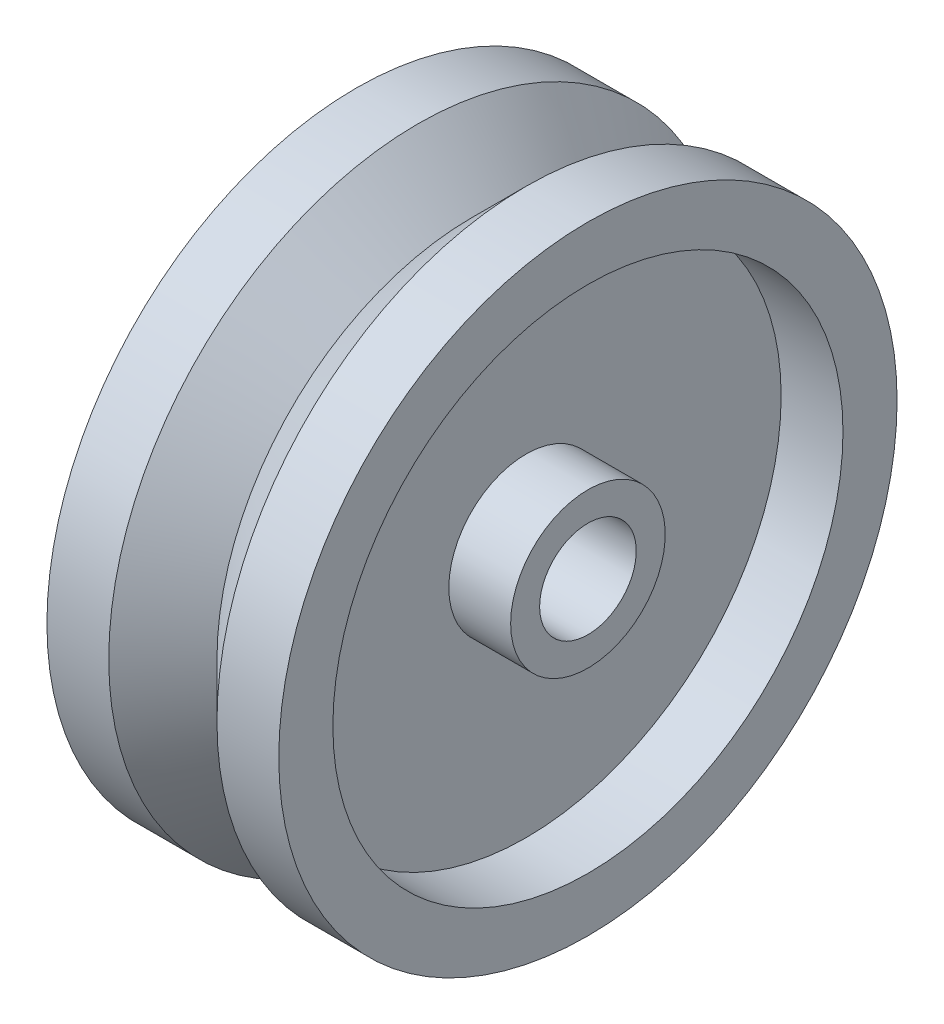
ISO-10303-21;
HEADER;
FILE_DESCRIPTION(('STEP AP214'),'2;1');
FILE_NAME('part.step','',(''),(''),'','','');
FILE_SCHEMA(('AUTOMOTIVE_DESIGN { 1 0 10303 214 1 1 1 1 }'));
ENDSEC;
DATA;
#1=APPLICATION_CONTEXT('core data for automotive mechanical design processes');
#2=APPLICATION_PROTOCOL_DEFINITION('international standard','automotive_design',2000,#1);
#3=PRODUCT_CONTEXT('',#1,'mechanical');
#4=PRODUCT('Part','Part','',(#3));
#5=PRODUCT_RELATED_PRODUCT_CATEGORY('part','',(#4));
#6=PRODUCT_DEFINITION_FORMATION('','',#4);
#7=PRODUCT_DEFINITION_CONTEXT('part definition',#1,'design');
#8=PRODUCT_DEFINITION('design','',#6,#7);
#9=PRODUCT_DEFINITION_SHAPE('','',#8);
#10=(LENGTH_UNIT() NAMED_UNIT(*) SI_UNIT(.MILLI.,.METRE.));
#11=(NAMED_UNIT(*) PLANE_ANGLE_UNIT() SI_UNIT($,.RADIAN.));
#12=(NAMED_UNIT(*) SI_UNIT($,.STERADIAN.) SOLID_ANGLE_UNIT());
#13=UNCERTAINTY_MEASURE_WITH_UNIT(LENGTH_MEASURE(1.E-05),#10,'distance_accuracy_value','');
#14=(GEOMETRIC_REPRESENTATION_CONTEXT(3) GLOBAL_UNCERTAINTY_ASSIGNED_CONTEXT((#13)) GLOBAL_UNIT_ASSIGNED_CONTEXT((#10,
#11,#12)) REPRESENTATION_CONTEXT('',''));
#15=CARTESIAN_POINT('',(0.,0.,0.));
#16=DIRECTION('',(0.,0.,1.));
#17=DIRECTION('',(1.,0.,0.));
#18=AXIS2_PLACEMENT_3D('',#15,#16,#17);
#19=CARTESIAN_POINT('',(-49.1417910447762,0.,0.));
#20=DIRECTION('',(-1.,0.,0.));
#21=DIRECTION('',(0.,0.,1.));
#22=AXIS2_PLACEMENT_3D('',#19,#20,#21);
#23=CYLINDRICAL_SURFACE('',#22,16.5);
#24=CARTESIAN_POINT('',(3.5,0.,0.));
#25=DIRECTION('',(-1.,0.,0.));
#26=DIRECTION('',(0.,0.,1.));
#27=AXIS2_PLACEMENT_3D('',#24,#25,#26);
#28=CIRCLE('',#27,16.5);
#29=CARTESIAN_POINT('',(3.5,0.,16.5));
#30=VERTEX_POINT('',#29);
#31=EDGE_CURVE('E92',#30,#30,#28,.T.);
#32=ORIENTED_EDGE('',*,*,#31,.T.);
#33=EDGE_LOOP('',(#32));
#34=FACE_BOUND('',#33,.T.);
#35=CARTESIAN_POINT('',(7.49999999999999,0.,0.));
#36=DIRECTION('',(-1.,0.,0.));
#37=DIRECTION('',(0.,0.,1.));
#38=AXIS2_PLACEMENT_3D('',#35,#36,#37);
#39=CIRCLE('',#38,16.5);
#40=CARTESIAN_POINT('',(7.49999999999999,0.,16.5));
#41=VERTEX_POINT('',#40);
#42=EDGE_CURVE('E10',#41,#41,#39,.T.);
#43=ORIENTED_EDGE('',*,*,#42,.F.);
#44=EDGE_LOOP('',(#43));
#45=FACE_BOUND('',#44,.T.);
#46=ADVANCED_FACE('F43',(#34,#45),#23,.F.);
#47=CARTESIAN_POINT('',(7.5,0.,0.));
#48=DIRECTION('',(1.,0.,0.));
#49=DIRECTION('',(0.,0.,-1.));
#50=AXIS2_PLACEMENT_3D('',#47,#48,#49);
#51=PLANE('',#50);
#52=ORIENTED_EDGE('',*,*,#42,.T.);
#53=EDGE_LOOP('',(#52));
#54=FACE_BOUND('',#53,.T.);
#55=CARTESIAN_POINT('',(7.49999999999999,0.,0.));
#56=DIRECTION('',(-1.,0.,0.));
#57=DIRECTION('',(0.,0.,1.));
#58=AXIS2_PLACEMENT_3D('',#55,#56,#57);
#59=CIRCLE('',#58,20.);
#60=CARTESIAN_POINT('',(7.49999999999999,0.,20.));
#61=VERTEX_POINT('',#60);
#62=EDGE_CURVE('E49',#61,#61,#59,.T.);
#63=ORIENTED_EDGE('',*,*,#62,.F.);
#64=EDGE_LOOP('',(#63));
#65=FACE_BOUND('',#64,.T.);
#66=ADVANCED_FACE('F110',(#54,#65),#51,.T.);
#67=CARTESIAN_POINT('',(-49.1417910447762,0.,0.));
#68=DIRECTION('',(-1.,0.,0.));
#69=DIRECTION('',(0.,0.,1.));
#70=AXIS2_PLACEMENT_3D('',#67,#68,#69);
#71=CYLINDRICAL_SURFACE('',#70,20.);
#72=ORIENTED_EDGE('',*,*,#62,.T.);
#73=EDGE_LOOP('',(#72));
#74=FACE_BOUND('',#73,.T.);
#75=CARTESIAN_POINT('',(3.49999999999982,0.,0.));
#76=DIRECTION('',(-1.,0.,0.));
#77=DIRECTION('',(0.,0.,1.));
#78=AXIS2_PLACEMENT_3D('',#75,#76,#77);
#79=CIRCLE('',#78,20.);
#80=CARTESIAN_POINT('',(3.49999999999982,0.,20.));
#81=VERTEX_POINT('',#80);
#82=EDGE_CURVE('E53',#81,#81,#79,.T.);
#83=ORIENTED_EDGE('',*,*,#82,.F.);
#84=EDGE_LOOP('',(#83));
#85=FACE_BOUND('',#84,.T.);
#86=ADVANCED_FACE('F114',(#74,#85),#71,.T.);
#87=CARTESIAN_POINT('',(0.,0.,0.));
#88=DIRECTION('',(1.,0.,0.));
#89=DIRECTION('',(0.,0.,-1.));
#90=AXIS2_PLACEMENT_3D('',#87,#88,#89);
#91=CONICAL_SURFACE('',#90,16.5,0.785398163397469);
#92=ORIENTED_EDGE('',*,*,#82,.T.);
#93=EDGE_LOOP('',(#92));
#94=FACE_BOUND('',#93,.T.);
#95=CARTESIAN_POINT('',(0.,0.,0.));
#96=DIRECTION('',(-1.,0.,0.));
#97=DIRECTION('',(0.,0.,1.));
#98=AXIS2_PLACEMENT_3D('',#95,#96,#97);
#99=CIRCLE('',#98,16.5);
#100=CARTESIAN_POINT('',(0.,0.,16.5));
#101=VERTEX_POINT('',#100);
#102=EDGE_CURVE('E57',#101,#101,#99,.T.);
#103=ORIENTED_EDGE('',*,*,#102,.F.);
#104=EDGE_LOOP('',(#103));
#105=FACE_BOUND('',#104,.T.);
#106=ADVANCED_FACE('F119',(#94,#105),#91,.T.);
#107=CARTESIAN_POINT('',(-3.5,0.,0.));
#108=DIRECTION('',(-1.,0.,0.));
#109=DIRECTION('',(0.,0.,1.));
#110=AXIS2_PLACEMENT_3D('',#107,#108,#109);
#111=CONICAL_SURFACE('',#110,20.,0.785398163397448);
#112=ORIENTED_EDGE('',*,*,#102,.T.);
#113=EDGE_LOOP('',(#112));
#114=FACE_BOUND('',#113,.T.);
#115=CARTESIAN_POINT('',(-3.5,0.,0.));
#116=DIRECTION('',(-1.,0.,0.));
#117=DIRECTION('',(0.,0.,1.));
#118=AXIS2_PLACEMENT_3D('',#115,#116,#117);
#119=CIRCLE('',#118,20.);
#120=CARTESIAN_POINT('',(-3.5,0.,20.));
#121=VERTEX_POINT('',#120);
#122=EDGE_CURVE('E62',#121,#121,#119,.T.);
#123=ORIENTED_EDGE('',*,*,#122,.F.);
#124=EDGE_LOOP('',(#123));
#125=FACE_BOUND('',#124,.T.);
#126=ADVANCED_FACE('F161',(#114,#125),#111,.T.);
#127=CARTESIAN_POINT('',(-49.1417910447762,0.,0.));
#128=DIRECTION('',(-1.,0.,0.));
#129=DIRECTION('',(0.,0.,1.));
#130=AXIS2_PLACEMENT_3D('',#127,#128,#129);
#131=CYLINDRICAL_SURFACE('',#130,20.);
#132=ORIENTED_EDGE('',*,*,#122,.T.);
#133=EDGE_LOOP('',(#132));
#134=FACE_BOUND('',#133,.T.);
#135=CARTESIAN_POINT('',(-7.50000000000001,0.,0.));
#136=DIRECTION('',(-1.,0.,0.));
#137=DIRECTION('',(0.,0.,1.));
#138=AXIS2_PLACEMENT_3D('',#135,#136,#137);
#139=CIRCLE('',#138,20.);
#140=CARTESIAN_POINT('',(-7.50000000000001,0.,20.));
#141=VERTEX_POINT('',#140);
#142=EDGE_CURVE('E65',#141,#141,#139,.T.);
#143=ORIENTED_EDGE('',*,*,#142,.F.);
#144=EDGE_LOOP('',(#143));
#145=FACE_BOUND('',#144,.T.);
#146=ADVANCED_FACE('F158',(#134,#145),#131,.T.);
#147=CARTESIAN_POINT('',(-7.5,0.,0.));
#148=DIRECTION('',(1.,0.,0.));
#149=DIRECTION('',(0.,0.,-1.));
#150=AXIS2_PLACEMENT_3D('',#147,#148,#149);
#151=PLANE('',#150);
#152=CARTESIAN_POINT('',(-7.5,0.,0.));
#153=DIRECTION('',(-1.,0.,0.));
#154=DIRECTION('',(0.,0.,1.));
#155=AXIS2_PLACEMENT_3D('',#152,#153,#154);
#156=CIRCLE('',#155,16.5);
#157=CARTESIAN_POINT('',(-7.5,0.,16.5));
#158=VERTEX_POINT('',#157);
#159=EDGE_CURVE('E68',#158,#158,#156,.T.);
#160=ORIENTED_EDGE('',*,*,#159,.F.);
#161=EDGE_LOOP('',(#160));
#162=FACE_BOUND('',#161,.T.);
#163=ORIENTED_EDGE('',*,*,#142,.T.);
#164=EDGE_LOOP('',(#163));
#165=FACE_BOUND('',#164,.T.);
#166=ADVANCED_FACE('F141',(#162,#165),#151,.F.);
#167=CARTESIAN_POINT('',(-49.1417910447762,0.,0.));
#168=DIRECTION('',(-1.,0.,0.));
#169=DIRECTION('',(0.,0.,1.));
#170=AXIS2_PLACEMENT_3D('',#167,#168,#169);
#171=CYLINDRICAL_SURFACE('',#170,16.5);
#172=CARTESIAN_POINT('',(-3.5,0.,0.));
#173=DIRECTION('',(-1.,0.,0.));
#174=DIRECTION('',(0.,0.,1.));
#175=AXIS2_PLACEMENT_3D('',#172,#173,#174);
#176=CIRCLE('',#175,16.5);
#177=CARTESIAN_POINT('',(-3.5,0.,16.5));
#178=VERTEX_POINT('',#177);
#179=EDGE_CURVE('E71',#178,#178,#176,.T.);
#180=ORIENTED_EDGE('',*,*,#179,.F.);
#181=EDGE_LOOP('',(#180));
#182=FACE_BOUND('',#181,.T.);
#183=ORIENTED_EDGE('',*,*,#159,.T.);
#184=EDGE_LOOP('',(#183));
#185=FACE_BOUND('',#184,.T.);
#186=ADVANCED_FACE('F151',(#182,#185),#171,.F.);
#187=CARTESIAN_POINT('',(-3.5,0.,0.));
#188=DIRECTION('',(1.,0.,0.));
#189=DIRECTION('',(0.,0.,-1.));
#190=AXIS2_PLACEMENT_3D('',#187,#188,#189);
#191=PLANE('',#190);
#192=CARTESIAN_POINT('',(-3.5,0.,0.));
#193=DIRECTION('',(-1.,0.,0.));
#194=DIRECTION('',(0.,0.,1.));
#195=AXIS2_PLACEMENT_3D('',#192,#193,#194);
#196=CIRCLE('',#195,5.);
#197=CARTESIAN_POINT('',(-3.5,0.,5.));
#198=VERTEX_POINT('',#197);
#199=EDGE_CURVE('E74',#198,#198,#196,.T.);
#200=ORIENTED_EDGE('',*,*,#199,.F.);
#201=EDGE_LOOP('',(#200));
#202=FACE_BOUND('',#201,.T.);
#203=ORIENTED_EDGE('',*,*,#179,.T.);
#204=EDGE_LOOP('',(#203));
#205=FACE_BOUND('',#204,.T.);
#206=ADVANCED_FACE('F145',(#202,#205),#191,.F.);
#207=CARTESIAN_POINT('',(-49.1417910447762,0.,0.));
#208=DIRECTION('',(-1.,0.,0.));
#209=DIRECTION('',(0.,0.,1.));
#210=AXIS2_PLACEMENT_3D('',#207,#208,#209);
#211=CYLINDRICAL_SURFACE('',#210,5.);
#212=ORIENTED_EDGE('',*,*,#199,.T.);
#213=EDGE_LOOP('',(#212));
#214=FACE_BOUND('',#213,.T.);
#215=CARTESIAN_POINT('',(-7.5,0.,0.));
#216=DIRECTION('',(-1.,0.,0.));
#217=DIRECTION('',(0.,0.,1.));
#218=AXIS2_PLACEMENT_3D('',#215,#216,#217);
#219=CIRCLE('',#218,5.);
#220=CARTESIAN_POINT('',(-7.5,0.,5.));
#221=VERTEX_POINT('',#220);
#222=EDGE_CURVE('E77',#221,#221,#219,.T.);
#223=ORIENTED_EDGE('',*,*,#222,.F.);
#224=EDGE_LOOP('',(#223));
#225=FACE_BOUND('',#224,.T.);
#226=ADVANCED_FACE('F139',(#214,#225),#211,.T.);
#227=CARTESIAN_POINT('',(-7.5,0.,0.));
#228=DIRECTION('',(-1.,0.,0.));
#229=DIRECTION('',(0.,0.,1.));
#230=AXIS2_PLACEMENT_3D('',#227,#228,#229);
#231=CIRCLE('',#230,3.125);
#232=CARTESIAN_POINT('',(-7.5,0.,3.125));
#233=VERTEX_POINT('',#232);
#234=EDGE_CURVE('E80',#233,#233,#231,.T.);
#235=ORIENTED_EDGE('',*,*,#234,.F.);
#236=EDGE_LOOP('',(#235));
#237=FACE_BOUND('',#236,.T.);
#238=ORIENTED_EDGE('',*,*,#222,.T.);
#239=EDGE_LOOP('',(#238));
#240=FACE_BOUND('',#239,.T.);
#241=ADVANCED_FACE('F128',(#237,#240),#151,.F.);
#242=CARTESIAN_POINT('',(-49.1417910447762,0.,0.));
#243=DIRECTION('',(-1.,0.,0.));
#244=DIRECTION('',(0.,0.,1.));
#245=AXIS2_PLACEMENT_3D('',#242,#243,#244);
#246=CYLINDRICAL_SURFACE('',#245,3.125);
#247=CARTESIAN_POINT('',(7.5,0.,0.));
#248=DIRECTION('',(-1.,0.,0.));
#249=DIRECTION('',(0.,0.,1.));
#250=AXIS2_PLACEMENT_3D('',#247,#248,#249);
#251=CIRCLE('',#250,3.125);
#252=CARTESIAN_POINT('',(7.5,0.,3.125));
#253=VERTEX_POINT('',#252);
#254=EDGE_CURVE('E83',#253,#253,#251,.T.);
#255=ORIENTED_EDGE('',*,*,#254,.F.);
#256=EDGE_LOOP('',(#255));
#257=FACE_BOUND('',#256,.T.);
#258=ORIENTED_EDGE('',*,*,#234,.T.);
#259=EDGE_LOOP('',(#258));
#260=FACE_BOUND('',#259,.T.);
#261=ADVANCED_FACE('F123',(#257,#260),#246,.F.);
#262=ORIENTED_EDGE('',*,*,#254,.T.);
#263=EDGE_LOOP('',(#262));
#264=FACE_BOUND('',#263,.T.);
#265=CARTESIAN_POINT('',(7.5,0.,0.));
#266=DIRECTION('',(-1.,0.,0.));
#267=DIRECTION('',(0.,0.,1.));
#268=AXIS2_PLACEMENT_3D('',#265,#266,#267);
#269=CIRCLE('',#268,5.);
#270=CARTESIAN_POINT('',(7.5,0.,5.));
#271=VERTEX_POINT('',#270);
#272=EDGE_CURVE('E86',#271,#271,#269,.T.);
#273=ORIENTED_EDGE('',*,*,#272,.F.);
#274=EDGE_LOOP('',(#273));
#275=FACE_BOUND('',#274,.T.);
#276=ADVANCED_FACE('F106',(#264,#275),#51,.T.);
#277=CARTESIAN_POINT('',(-49.1417910447762,0.,0.));
#278=DIRECTION('',(-1.,0.,0.));
#279=DIRECTION('',(0.,0.,1.));
#280=AXIS2_PLACEMENT_3D('',#277,#278,#279);
#281=CYLINDRICAL_SURFACE('',#280,5.00000000000003);
#282=CARTESIAN_POINT('',(3.50000000000015,0.,0.));
#283=DIRECTION('',(-1.,0.,0.));
#284=DIRECTION('',(0.,0.,1.));
#285=AXIS2_PLACEMENT_3D('',#282,#283,#284);
#286=CIRCLE('',#285,5.00000000000005);
#287=CARTESIAN_POINT('',(3.50000000000015,0.,5.00000000000005));
#288=VERTEX_POINT('',#287);
#289=EDGE_CURVE('E89',#288,#288,#286,.T.);
#290=ORIENTED_EDGE('',*,*,#289,.F.);
#291=EDGE_LOOP('',(#290));
#292=FACE_BOUND('',#291,.T.);
#293=ORIENTED_EDGE('',*,*,#272,.T.);
#294=EDGE_LOOP('',(#293));
#295=FACE_BOUND('',#294,.T.);
#296=ADVANCED_FACE('F100',(#292,#295),#281,.T.);
#297=CARTESIAN_POINT('',(3.50000000000008,0.,0.));
#298=DIRECTION('',(1.,0.,0.));
#299=DIRECTION('',(0.,0.,-1.));
#300=AXIS2_PLACEMENT_3D('',#297,#298,#299);
#301=PLANE('',#300);
#302=ORIENTED_EDGE('',*,*,#289,.T.);
#303=EDGE_LOOP('',(#302));
#304=FACE_BOUND('',#303,.T.);
#305=ORIENTED_EDGE('',*,*,#31,.F.);
#306=EDGE_LOOP('',(#305));
#307=FACE_BOUND('',#306,.T.);
#308=ADVANCED_FACE('F98',(#304,#307),#301,.T.);
#309=CLOSED_SHELL('',(#46,#66,#86,#106,#126,#146,#166,#186,#206,#226,#241,#261,#276,#296,#308));
#310=MANIFOLD_SOLID_BREP('B2',#309);
#311=ADVANCED_BREP_SHAPE_REPRESENTATION('',(#18,#310),#14);
#312=SHAPE_DEFINITION_REPRESENTATION(#9,#311);
ENDSEC;
END-ISO-10303-21;
